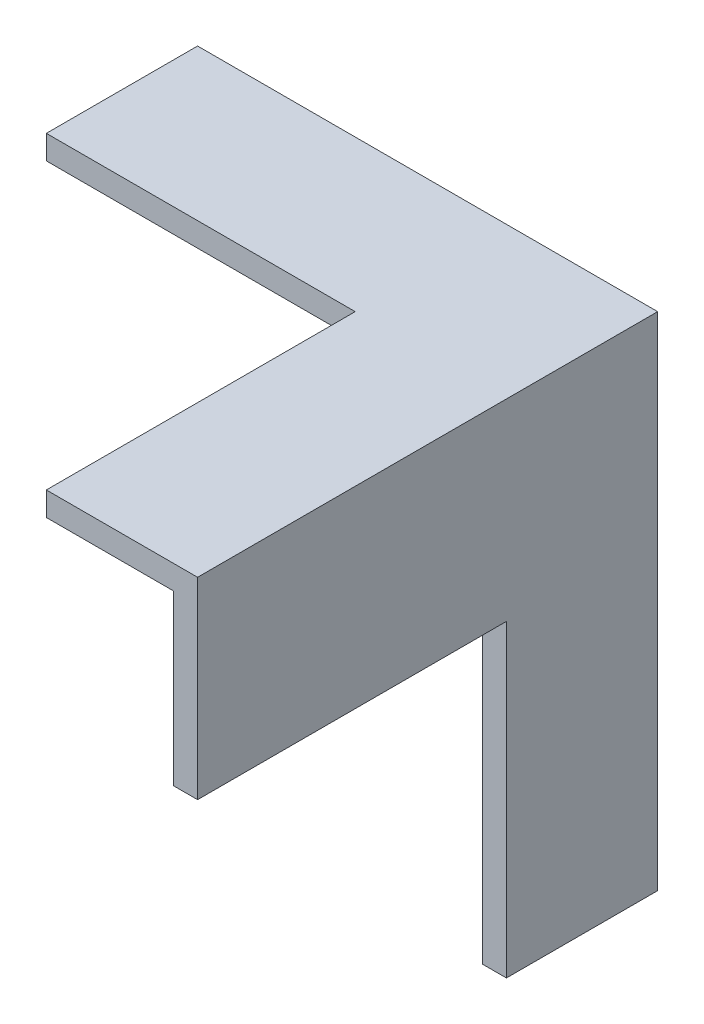
ISO-10303-21;
HEADER;
FILE_DESCRIPTION(('STEP AP214'),'2;1');
FILE_NAME('part.step','',(''),(''),'','','');
FILE_SCHEMA(('AUTOMOTIVE_DESIGN { 1 0 10303 214 1 1 1 1 }'));
ENDSEC;
DATA;
#1=APPLICATION_CONTEXT('core data for automotive mechanical design processes');
#2=APPLICATION_PROTOCOL_DEFINITION('international standard','automotive_design',2000,#1);
#3=PRODUCT_CONTEXT('',#1,'mechanical');
#4=PRODUCT('Part','Part','',(#3));
#5=PRODUCT_RELATED_PRODUCT_CATEGORY('part','',(#4));
#6=PRODUCT_DEFINITION_FORMATION('','',#4);
#7=PRODUCT_DEFINITION_CONTEXT('part definition',#1,'design');
#8=PRODUCT_DEFINITION('design','',#6,#7);
#9=PRODUCT_DEFINITION_SHAPE('','',#8);
#10=(LENGTH_UNIT() NAMED_UNIT(*) SI_UNIT(.MILLI.,.METRE.));
#11=(NAMED_UNIT(*) PLANE_ANGLE_UNIT() SI_UNIT($,.RADIAN.));
#12=(NAMED_UNIT(*) SI_UNIT($,.STERADIAN.) SOLID_ANGLE_UNIT());
#13=UNCERTAINTY_MEASURE_WITH_UNIT(LENGTH_MEASURE(1.E-05),#10,'distance_accuracy_value','');
#14=(GEOMETRIC_REPRESENTATION_CONTEXT(3) GLOBAL_UNCERTAINTY_ASSIGNED_CONTEXT((#13)) GLOBAL_UNIT_ASSIGNED_CONTEXT((#10,
#11,#12)) REPRESENTATION_CONTEXT('',''));
#15=CARTESIAN_POINT('',(0.,0.,0.));
#16=DIRECTION('',(0.,0.,1.));
#17=DIRECTION('',(1.,0.,0.));
#18=AXIS2_PLACEMENT_3D('',#15,#16,#17);
#19=CARTESIAN_POINT('',(3.81,-26.924,0.));
#20=DIRECTION('',(0.,0.,-1.));
#21=DIRECTION('',(0.,1.,0.));
#22=AXIS2_PLACEMENT_3D('',#19,#20,#21);
#23=PLANE('',#22);
#24=DIRECTION('',(0.,-1.,0.));
#25=VECTOR('',#24,1.);
#26=CARTESIAN_POINT('',(0.,-26.924,0.));
#27=LINE('',#26,#25);
#28=CARTESIAN_POINT('',(0.,0.,0.));
#29=VERTEX_POINT('',#28);
#30=CARTESIAN_POINT('',(0.,-26.924,0.));
#31=VERTEX_POINT('',#30);
#32=EDGE_CURVE('E143',#29,#31,#27,.T.);
#33=ORIENTED_EDGE('',*,*,#32,.T.);
#34=DIRECTION('',(-1.,0.,0.));
#35=VECTOR('',#34,1.);
#36=CARTESIAN_POINT('',(3.81,-26.924,0.));
#37=LINE('',#36,#35);
#38=CARTESIAN_POINT('',(3.81,-26.924,0.));
#39=VERTEX_POINT('',#38);
#40=EDGE_CURVE('E11',#39,#31,#37,.T.);
#41=ORIENTED_EDGE('',*,*,#40,.F.);
#42=DIRECTION('',(0.,-1.,0.));
#43=VECTOR('',#42,1.);
#44=CARTESIAN_POINT('',(3.81,-26.924,0.));
#45=LINE('',#44,#43);
#46=CARTESIAN_POINT('',(3.81,3.81,0.));
#47=VERTEX_POINT('',#46);
#48=EDGE_CURVE('E152',#47,#39,#45,.T.);
#49=ORIENTED_EDGE('',*,*,#48,.F.);
#50=DIRECTION('',(1.,0.,0.));
#51=VECTOR('',#50,1.);
#52=CARTESIAN_POINT('',(-20.32,3.81,0.));
#53=LINE('',#52,#51);
#54=CARTESIAN_POINT('',(-20.32,3.81,0.));
#55=VERTEX_POINT('',#54);
#56=EDGE_CURVE('E196',#55,#47,#53,.T.);
#57=ORIENTED_EDGE('',*,*,#56,.F.);
#58=DIRECTION('',(0.,-1.,0.));
#59=VECTOR('',#58,1.);
#60=CARTESIAN_POINT('',(-20.32,3.81,0.));
#61=LINE('',#60,#59);
#62=CARTESIAN_POINT('',(-20.32,0.,0.));
#63=VERTEX_POINT('',#62);
#64=EDGE_CURVE('E148',#55,#63,#61,.T.);
#65=ORIENTED_EDGE('',*,*,#64,.T.);
#66=DIRECTION('',(1.,0.,0.));
#67=VECTOR('',#66,1.);
#68=CARTESIAN_POINT('',(-20.32,0.,0.));
#69=LINE('',#68,#67);
#70=EDGE_CURVE('E184',#63,#29,#69,.T.);
#71=ORIENTED_EDGE('',*,*,#70,.T.);
#72=EDGE_LOOP('',(#33,#41,#49,#57,#65,#71));
#73=FACE_BOUND('',#72,.T.);
#74=ADVANCED_FACE('F32',(#73),#23,.F.);
#75=CARTESIAN_POINT('',(3.81,-26.924,-49.276));
#76=DIRECTION('',(0.,1.,0.));
#77=DIRECTION('',(0.,0.,1.));
#78=AXIS2_PLACEMENT_3D('',#75,#76,#77);
#79=PLANE('',#78);
#80=DIRECTION('',(0.,0.,-1.));
#81=VECTOR('',#80,1.);
#82=CARTESIAN_POINT('',(0.,-26.924,-49.276));
#83=LINE('',#82,#81);
#84=CARTESIAN_POINT('',(0.,-26.924,-49.276));
#85=VERTEX_POINT('',#84);
#86=EDGE_CURVE('E146',#31,#85,#83,.T.);
#87=ORIENTED_EDGE('',*,*,#86,.T.);
#88=DIRECTION('',(-1.,0.,0.));
#89=VECTOR('',#88,1.);
#90=CARTESIAN_POINT('',(3.81,-26.924,-49.276));
#91=LINE('',#90,#89);
#92=CARTESIAN_POINT('',(3.81,-26.924,-49.276));
#93=VERTEX_POINT('',#92);
#94=EDGE_CURVE('E40',#93,#85,#91,.T.);
#95=ORIENTED_EDGE('',*,*,#94,.F.);
#96=DIRECTION('',(0.,0.,-1.));
#97=VECTOR('',#96,1.);
#98=CARTESIAN_POINT('',(3.81,-26.924,-49.276));
#99=LINE('',#98,#97);
#100=EDGE_CURVE('E82',#39,#93,#99,.T.);
#101=ORIENTED_EDGE('',*,*,#100,.F.);
#102=ORIENTED_EDGE('',*,*,#40,.T.);
#103=EDGE_LOOP('',(#87,#95,#101,#102));
#104=FACE_BOUND('',#103,.T.);
#105=ADVANCED_FACE('F219',(#104),#79,.F.);
#106=CARTESIAN_POINT('',(3.81,-76.2,-49.276));
#107=DIRECTION('',(0.,0.,-1.));
#108=DIRECTION('',(-1.,0.,0.));
#109=AXIS2_PLACEMENT_3D('',#106,#107,#108);
#110=PLANE('',#109);
#111=DIRECTION('',(0.,-1.,0.));
#112=VECTOR('',#111,1.);
#113=CARTESIAN_POINT('',(0.,-76.2,-49.276));
#114=LINE('',#113,#112);
#115=CARTESIAN_POINT('',(0.,-76.2,-49.276));
#116=VERTEX_POINT('',#115);
#117=EDGE_CURVE('E163',#85,#116,#114,.T.);
#118=ORIENTED_EDGE('',*,*,#117,.T.);
#119=DIRECTION('',(-1.,0.,0.));
#120=VECTOR('',#119,1.);
#121=CARTESIAN_POINT('',(3.81,-76.2,-49.276));
#122=LINE('',#121,#120);
#123=CARTESIAN_POINT('',(3.81,-76.2,-49.276));
#124=VERTEX_POINT('',#123);
#125=EDGE_CURVE('E170',#124,#116,#122,.T.);
#126=ORIENTED_EDGE('',*,*,#125,.F.);
#127=DIRECTION('',(0.,-1.,0.));
#128=VECTOR('',#127,1.);
#129=CARTESIAN_POINT('',(3.81,-76.2,-49.276));
#130=LINE('',#129,#128);
#131=EDGE_CURVE('E156',#93,#124,#130,.T.);
#132=ORIENTED_EDGE('',*,*,#131,.F.);
#133=ORIENTED_EDGE('',*,*,#94,.T.);
#134=EDGE_LOOP('',(#118,#126,#132,#133));
#135=FACE_BOUND('',#134,.T.);
#136=ADVANCED_FACE('F175',(#135),#110,.F.);
#137=CARTESIAN_POINT('',(3.81,-76.2,-73.406));
#138=DIRECTION('',(0.,1.,0.));
#139=DIRECTION('',(0.,0.,1.));
#140=AXIS2_PLACEMENT_3D('',#137,#138,#139);
#141=PLANE('',#140);
#142=DIRECTION('',(0.,0.,-1.));
#143=VECTOR('',#142,1.);
#144=CARTESIAN_POINT('',(0.,-76.2,-73.406));
#145=LINE('',#144,#143);
#146=CARTESIAN_POINT('',(0.,-76.2,-73.406));
#147=VERTEX_POINT('',#146);
#148=EDGE_CURVE('E68',#116,#147,#145,.T.);
#149=ORIENTED_EDGE('',*,*,#148,.T.);
#150=DIRECTION('',(-1.,0.,0.));
#151=VECTOR('',#150,1.);
#152=CARTESIAN_POINT('',(3.81,-76.2,-73.406));
#153=LINE('',#152,#151);
#154=CARTESIAN_POINT('',(3.81,-76.2,-73.406));
#155=VERTEX_POINT('',#154);
#156=EDGE_CURVE('E160',#155,#147,#153,.T.);
#157=ORIENTED_EDGE('',*,*,#156,.F.);
#158=DIRECTION('',(0.,0.,-1.));
#159=VECTOR('',#158,1.);
#160=CARTESIAN_POINT('',(3.81,-76.2,-73.406));
#161=LINE('',#160,#159);
#162=EDGE_CURVE('E48',#124,#155,#161,.T.);
#163=ORIENTED_EDGE('',*,*,#162,.F.);
#164=ORIENTED_EDGE('',*,*,#125,.T.);
#165=EDGE_LOOP('',(#149,#157,#163,#164));
#166=FACE_BOUND('',#165,.T.);
#167=ADVANCED_FACE('F226',(#166),#141,.F.);
#168=CARTESIAN_POINT('',(3.81,0.,-73.406));
#169=DIRECTION('',(0.,0.,1.));
#170=DIRECTION('',(0.,-1.,0.));
#171=AXIS2_PLACEMENT_3D('',#168,#169,#170);
#172=PLANE('',#171);
#173=DIRECTION('',(0.,1.,0.));
#174=VECTOR('',#173,1.);
#175=CARTESIAN_POINT('',(0.,0.,-73.406));
#176=LINE('',#175,#174);
#177=CARTESIAN_POINT('',(0.,0.,-73.406));
#178=VERTEX_POINT('',#177);
#179=EDGE_CURVE('E75',#147,#178,#176,.T.);
#180=ORIENTED_EDGE('',*,*,#179,.T.);
#181=DIRECTION('',(-1.,0.,0.));
#182=VECTOR('',#181,1.);
#183=CARTESIAN_POINT('',(-69.596,0.,-73.406));
#184=LINE('',#183,#182);
#185=CARTESIAN_POINT('',(-69.596,0.,-73.406));
#186=VERTEX_POINT('',#185);
#187=EDGE_CURVE('E138',#178,#186,#184,.T.);
#188=ORIENTED_EDGE('',*,*,#187,.T.);
#189=DIRECTION('',(0.,-1.,0.));
#190=VECTOR('',#189,1.);
#191=CARTESIAN_POINT('',(-69.596,3.81,-73.406));
#192=LINE('',#191,#190);
#193=CARTESIAN_POINT('',(-69.596,3.81,-73.406));
#194=VERTEX_POINT('',#193);
#195=EDGE_CURVE('E190',#194,#186,#192,.T.);
#196=ORIENTED_EDGE('',*,*,#195,.F.);
#197=DIRECTION('',(-1.,0.,0.));
#198=VECTOR('',#197,1.);
#199=CARTESIAN_POINT('',(-69.596,3.81,-73.406));
#200=LINE('',#199,#198);
#201=CARTESIAN_POINT('',(3.81,3.81,-73.406));
#202=VERTEX_POINT('',#201);
#203=EDGE_CURVE('E134',#202,#194,#200,.T.);
#204=ORIENTED_EDGE('',*,*,#203,.F.);
#205=DIRECTION('',(0.,1.,0.));
#206=VECTOR('',#205,1.);
#207=CARTESIAN_POINT('',(3.81,0.,-73.406));
#208=LINE('',#207,#206);
#209=EDGE_CURVE('E159',#155,#202,#208,.T.);
#210=ORIENTED_EDGE('',*,*,#209,.F.);
#211=ORIENTED_EDGE('',*,*,#156,.T.);
#212=EDGE_LOOP('',(#180,#188,#196,#204,#210,#211));
#213=FACE_BOUND('',#212,.T.);
#214=ADVANCED_FACE('F231',(#213),#172,.F.);
#215=CARTESIAN_POINT('',(3.81,0.,0.));
#216=DIRECTION('',(-1.,0.,0.));
#217=DIRECTION('',(0.,0.,1.));
#218=AXIS2_PLACEMENT_3D('',#215,#216,#217);
#219=PLANE('',#218);
#220=ORIENTED_EDGE('',*,*,#48,.T.);
#221=ORIENTED_EDGE('',*,*,#100,.T.);
#222=ORIENTED_EDGE('',*,*,#131,.T.);
#223=ORIENTED_EDGE('',*,*,#162,.T.);
#224=ORIENTED_EDGE('',*,*,#209,.T.);
#225=DIRECTION('',(0.,0.,-1.));
#226=VECTOR('',#225,1.);
#227=CARTESIAN_POINT('',(3.81,3.81,0.));
#228=LINE('',#227,#226);
#229=EDGE_CURVE('E204',#47,#202,#228,.T.);
#230=ORIENTED_EDGE('',*,*,#229,.F.);
#231=EDGE_LOOP('',(#220,#221,#222,#223,#224,#230));
#232=FACE_BOUND('',#231,.T.);
#233=ADVANCED_FACE('F234',(#232),#219,.F.);
#234=CARTESIAN_POINT('',(0.,0.,0.));
#235=DIRECTION('',(-1.,0.,0.));
#236=DIRECTION('',(0.,0.,1.));
#237=AXIS2_PLACEMENT_3D('',#234,#235,#236);
#238=PLANE('',#237);
#239=ORIENTED_EDGE('',*,*,#32,.F.);
#240=DIRECTION('',(0.,0.,1.));
#241=VECTOR('',#240,1.);
#242=CARTESIAN_POINT('',(0.,0.,0.));
#243=LINE('',#242,#241);
#244=EDGE_CURVE('E154',#178,#29,#243,.T.);
#245=ORIENTED_EDGE('',*,*,#244,.F.);
#246=ORIENTED_EDGE('',*,*,#179,.F.);
#247=ORIENTED_EDGE('',*,*,#148,.F.);
#248=ORIENTED_EDGE('',*,*,#117,.F.);
#249=ORIENTED_EDGE('',*,*,#86,.F.);
#250=EDGE_LOOP('',(#239,#245,#246,#247,#248,#249));
#251=FACE_BOUND('',#250,.T.);
#252=ADVANCED_FACE('F178',(#251),#238,.T.);
#253=CARTESIAN_POINT('',(0.,0.,0.));
#254=DIRECTION('',(0.,1.,0.));
#255=DIRECTION('',(0.,0.,1.));
#256=AXIS2_PLACEMENT_3D('',#253,#254,#255);
#257=PLANE('',#256);
#258=ORIENTED_EDGE('',*,*,#187,.F.);
#259=ORIENTED_EDGE('',*,*,#244,.T.);
#260=ORIENTED_EDGE('',*,*,#70,.F.);
#261=DIRECTION('',(0.,0.,1.));
#262=VECTOR('',#261,1.);
#263=CARTESIAN_POINT('',(-20.32,0.,-49.276));
#264=LINE('',#263,#262);
#265=CARTESIAN_POINT('',(-20.32,0.,-49.276));
#266=VERTEX_POINT('',#265);
#267=EDGE_CURVE('E186',#266,#63,#264,.T.);
#268=ORIENTED_EDGE('',*,*,#267,.F.);
#269=DIRECTION('',(1.,0.,0.));
#270=VECTOR('',#269,1.);
#271=CARTESIAN_POINT('',(-69.596,0.,-49.276));
#272=LINE('',#271,#270);
#273=CARTESIAN_POINT('',(-69.596,0.,-49.276));
#274=VERTEX_POINT('',#273);
#275=EDGE_CURVE('E199',#274,#266,#272,.T.);
#276=ORIENTED_EDGE('',*,*,#275,.F.);
#277=DIRECTION('',(0.,0.,1.));
#278=VECTOR('',#277,1.);
#279=CARTESIAN_POINT('',(-69.596,0.,-73.406));
#280=LINE('',#279,#278);
#281=EDGE_CURVE('E142',#186,#274,#280,.T.);
#282=ORIENTED_EDGE('',*,*,#281,.F.);
#283=EDGE_LOOP('',(#258,#259,#260,#268,#276,#282));
#284=FACE_BOUND('',#283,.T.);
#285=ADVANCED_FACE('F183',(#284),#257,.F.);
#286=CARTESIAN_POINT('',(-69.596,3.81,-73.406));
#287=DIRECTION('',(1.,0.,0.));
#288=DIRECTION('',(0.,0.,-1.));
#289=AXIS2_PLACEMENT_3D('',#286,#287,#288);
#290=PLANE('',#289);
#291=ORIENTED_EDGE('',*,*,#281,.T.);
#292=DIRECTION('',(0.,-1.,0.));
#293=VECTOR('',#292,1.);
#294=CARTESIAN_POINT('',(-69.596,3.81,-49.276));
#295=LINE('',#294,#293);
#296=CARTESIAN_POINT('',(-69.596,3.81,-49.276));
#297=VERTEX_POINT('',#296);
#298=EDGE_CURVE('E121',#297,#274,#295,.T.);
#299=ORIENTED_EDGE('',*,*,#298,.F.);
#300=DIRECTION('',(0.,0.,1.));
#301=VECTOR('',#300,1.);
#302=CARTESIAN_POINT('',(-69.596,3.81,-73.406));
#303=LINE('',#302,#301);
#304=EDGE_CURVE('E128',#194,#297,#303,.T.);
#305=ORIENTED_EDGE('',*,*,#304,.F.);
#306=ORIENTED_EDGE('',*,*,#195,.T.);
#307=EDGE_LOOP('',(#291,#299,#305,#306));
#308=FACE_BOUND('',#307,.T.);
#309=ADVANCED_FACE('F140',(#308),#290,.F.);
#310=CARTESIAN_POINT('',(-69.596,3.81,-49.276));
#311=DIRECTION('',(0.,0.,-1.));
#312=DIRECTION('',(-1.,0.,0.));
#313=AXIS2_PLACEMENT_3D('',#310,#311,#312);
#314=PLANE('',#313);
#315=ORIENTED_EDGE('',*,*,#275,.T.);
#316=DIRECTION('',(0.,-1.,0.));
#317=VECTOR('',#316,1.);
#318=CARTESIAN_POINT('',(-20.32,3.81,-49.276));
#319=LINE('',#318,#317);
#320=CARTESIAN_POINT('',(-20.32,3.81,-49.276));
#321=VERTEX_POINT('',#320);
#322=EDGE_CURVE('E124',#321,#266,#319,.T.);
#323=ORIENTED_EDGE('',*,*,#322,.F.);
#324=DIRECTION('',(1.,0.,0.));
#325=VECTOR('',#324,1.);
#326=CARTESIAN_POINT('',(-69.596,3.81,-49.276));
#327=LINE('',#326,#325);
#328=EDGE_CURVE('E117',#297,#321,#327,.T.);
#329=ORIENTED_EDGE('',*,*,#328,.F.);
#330=ORIENTED_EDGE('',*,*,#298,.T.);
#331=EDGE_LOOP('',(#315,#323,#329,#330));
#332=FACE_BOUND('',#331,.T.);
#333=ADVANCED_FACE('F119',(#332),#314,.F.);
#334=CARTESIAN_POINT('',(-20.32,3.81,-49.276));
#335=DIRECTION('',(1.,0.,0.));
#336=DIRECTION('',(0.,0.,-1.));
#337=AXIS2_PLACEMENT_3D('',#334,#335,#336);
#338=PLANE('',#337);
#339=ORIENTED_EDGE('',*,*,#267,.T.);
#340=ORIENTED_EDGE('',*,*,#64,.F.);
#341=DIRECTION('',(0.,0.,1.));
#342=VECTOR('',#341,1.);
#343=CARTESIAN_POINT('',(-20.32,3.81,-49.276));
#344=LINE('',#343,#342);
#345=EDGE_CURVE('E127',#321,#55,#344,.T.);
#346=ORIENTED_EDGE('',*,*,#345,.F.);
#347=ORIENTED_EDGE('',*,*,#322,.T.);
#348=EDGE_LOOP('',(#339,#340,#346,#347));
#349=FACE_BOUND('',#348,.T.);
#350=ADVANCED_FACE('F208',(#349),#338,.F.);
#351=CARTESIAN_POINT('',(0.,3.81,0.));
#352=DIRECTION('',(0.,1.,0.));
#353=DIRECTION('',(0.,0.,1.));
#354=AXIS2_PLACEMENT_3D('',#351,#352,#353);
#355=PLANE('',#354);
#356=ORIENTED_EDGE('',*,*,#304,.T.);
#357=ORIENTED_EDGE('',*,*,#328,.T.);
#358=ORIENTED_EDGE('',*,*,#345,.T.);
#359=ORIENTED_EDGE('',*,*,#56,.T.);
#360=ORIENTED_EDGE('',*,*,#229,.T.);
#361=ORIENTED_EDGE('',*,*,#203,.T.);
#362=EDGE_LOOP('',(#356,#357,#358,#359,#360,#361));
#363=FACE_BOUND('',#362,.T.);
#364=ADVANCED_FACE('F131',(#363),#355,.T.);
#365=CLOSED_SHELL('',(#74,#105,#136,#167,#214,#233,#252,#285,#309,#333,#350,#364));
#366=MANIFOLD_SOLID_BREP('B2',#365);
#367=ADVANCED_BREP_SHAPE_REPRESENTATION('',(#18,#366),#14);
#368=SHAPE_DEFINITION_REPRESENTATION(#9,#367);
ENDSEC;
END-ISO-10303-21;
